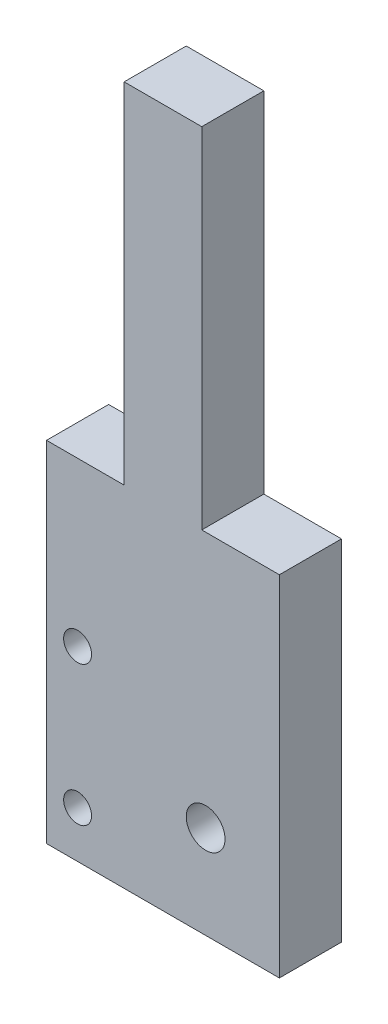
ISO-10303-21;
HEADER;
FILE_DESCRIPTION(('STEP AP214'),'2;1');
FILE_NAME('part.step','',(''),(''),'','','');
FILE_SCHEMA(('AUTOMOTIVE_DESIGN { 1 0 10303 214 1 1 1 1 }'));
ENDSEC;
DATA;
#1=APPLICATION_CONTEXT('core data for automotive mechanical design processes');
#2=APPLICATION_PROTOCOL_DEFINITION('international standard','automotive_design',2000,#1);
#3=PRODUCT_CONTEXT('',#1,'mechanical');
#4=PRODUCT('Part','Part','',(#3));
#5=PRODUCT_RELATED_PRODUCT_CATEGORY('part','',(#4));
#6=PRODUCT_DEFINITION_FORMATION('','',#4);
#7=PRODUCT_DEFINITION_CONTEXT('part definition',#1,'design');
#8=PRODUCT_DEFINITION('design','',#6,#7);
#9=PRODUCT_DEFINITION_SHAPE('','',#8);
#10=(LENGTH_UNIT() NAMED_UNIT(*) SI_UNIT(.MILLI.,.METRE.));
#11=(NAMED_UNIT(*) PLANE_ANGLE_UNIT() SI_UNIT($,.RADIAN.));
#12=(NAMED_UNIT(*) SI_UNIT($,.STERADIAN.) SOLID_ANGLE_UNIT());
#13=UNCERTAINTY_MEASURE_WITH_UNIT(LENGTH_MEASURE(1.E-05),#10,'distance_accuracy_value','');
#14=(GEOMETRIC_REPRESENTATION_CONTEXT(3) GLOBAL_UNCERTAINTY_ASSIGNED_CONTEXT((#13)) GLOBAL_UNIT_ASSIGNED_CONTEXT((#10,
#11,#12)) REPRESENTATION_CONTEXT('',''));
#15=CARTESIAN_POINT('',(0.,0.,0.));
#16=DIRECTION('',(0.,0.,1.));
#17=DIRECTION('',(1.,0.,0.));
#18=AXIS2_PLACEMENT_3D('',#15,#16,#17);
#19=CARTESIAN_POINT('',(0.,0.,10.16));
#20=DIRECTION('',(0.,0.,1.));
#21=DIRECTION('',(1.,0.,0.));
#22=AXIS2_PLACEMENT_3D('',#19,#20,#21);
#23=PLANE('',#22);
#24=CARTESIAN_POINT('',(5.08,30.48,10.16));
#25=DIRECTION('',(0.,0.,1.));
#26=DIRECTION('',(1.,0.,0.));
#27=AXIS2_PLACEMENT_3D('',#24,#25,#26);
#28=CIRCLE('',#27,2.286);
#29=CARTESIAN_POINT('',(7.366,30.48,10.16));
#30=VERTEX_POINT('',#29);
#31=EDGE_CURVE('E181',#30,#30,#28,.T.);
#32=ORIENTED_EDGE('',*,*,#31,.F.);
#33=EDGE_LOOP('',(#32));
#34=FACE_BOUND('',#33,.T.);
#35=DIRECTION('',(0.,-1.,0.));
#36=VECTOR('',#35,1.);
#37=CARTESIAN_POINT('',(0.,57.15,10.16));
#38=LINE('',#37,#36);
#39=CARTESIAN_POINT('',(0.,57.15,10.16));
#40=VERTEX_POINT('',#39);
#41=CARTESIAN_POINT('',(0.,0.,10.16));
#42=VERTEX_POINT('',#41);
#43=EDGE_CURVE('E144',#40,#42,#38,.T.);
#44=ORIENTED_EDGE('',*,*,#43,.T.);
#45=DIRECTION('',(1.,0.,0.));
#46=VECTOR('',#45,1.);
#47=CARTESIAN_POINT('',(0.,0.,10.16));
#48=LINE('',#47,#46);
#49=CARTESIAN_POINT('',(38.1,0.,10.16));
#50=VERTEX_POINT('',#49);
#51=EDGE_CURVE('E92',#42,#50,#48,.T.);
#52=ORIENTED_EDGE('',*,*,#51,.T.);
#53=DIRECTION('',(0.,1.,0.));
#54=VECTOR('',#53,1.);
#55=CARTESIAN_POINT('',(38.1,57.15,10.16));
#56=LINE('',#55,#54);
#57=CARTESIAN_POINT('',(38.1,57.15,10.16));
#58=VERTEX_POINT('',#57);
#59=EDGE_CURVE('E159',#50,#58,#56,.T.);
#60=ORIENTED_EDGE('',*,*,#59,.T.);
#61=DIRECTION('',(-1.,0.,0.));
#62=VECTOR('',#61,1.);
#63=CARTESIAN_POINT('',(25.4,57.15,10.16));
#64=LINE('',#63,#62);
#65=CARTESIAN_POINT('',(25.4,57.15,10.16));
#66=VERTEX_POINT('',#65);
#67=EDGE_CURVE('E172',#58,#66,#64,.T.);
#68=ORIENTED_EDGE('',*,*,#67,.T.);
#69=DIRECTION('',(0.,1.,0.));
#70=VECTOR('',#69,1.);
#71=CARTESIAN_POINT('',(25.4,114.3,10.16));
#72=LINE('',#71,#70);
#73=CARTESIAN_POINT('',(25.4,114.3,10.16));
#74=VERTEX_POINT('',#73);
#75=EDGE_CURVE('E111',#66,#74,#72,.T.);
#76=ORIENTED_EDGE('',*,*,#75,.T.);
#77=DIRECTION('',(-1.,0.,0.));
#78=VECTOR('',#77,1.);
#79=CARTESIAN_POINT('',(12.7,114.3,10.16));
#80=LINE('',#79,#78);
#81=CARTESIAN_POINT('',(12.7,114.3,10.16));
#82=VERTEX_POINT('',#81);
#83=EDGE_CURVE('E105',#74,#82,#80,.T.);
#84=ORIENTED_EDGE('',*,*,#83,.T.);
#85=DIRECTION('',(0.,-1.,0.));
#86=VECTOR('',#85,1.);
#87=CARTESIAN_POINT('',(12.7,57.15,10.16));
#88=LINE('',#87,#86);
#89=CARTESIAN_POINT('',(12.7,57.15,10.16));
#90=VERTEX_POINT('',#89);
#91=EDGE_CURVE('E109',#82,#90,#88,.T.);
#92=ORIENTED_EDGE('',*,*,#91,.T.);
#93=DIRECTION('',(-1.,0.,0.));
#94=VECTOR('',#93,1.);
#95=CARTESIAN_POINT('',(0.,57.15,10.16));
#96=LINE('',#95,#94);
#97=EDGE_CURVE('E49',#90,#40,#96,.T.);
#98=ORIENTED_EDGE('',*,*,#97,.T.);
#99=EDGE_LOOP('',(#44,#52,#60,#68,#76,#84,#92,#98));
#100=FACE_BOUND('',#99,.T.);
#101=CARTESIAN_POINT('',(5.08,7.62,10.16));
#102=DIRECTION('',(0.,0.,1.));
#103=DIRECTION('',(1.,0.,0.));
#104=AXIS2_PLACEMENT_3D('',#101,#102,#103);
#105=CIRCLE('',#104,2.286);
#106=CARTESIAN_POINT('',(7.366,7.62,10.16));
#107=VERTEX_POINT('',#106);
#108=EDGE_CURVE('E133',#107,#107,#105,.T.);
#109=ORIENTED_EDGE('',*,*,#108,.F.);
#110=EDGE_LOOP('',(#109));
#111=FACE_BOUND('',#110,.T.);
#112=CARTESIAN_POINT('',(26.035,15.24,10.16));
#113=DIRECTION('',(0.,0.,1.));
#114=DIRECTION('',(1.,0.,0.));
#115=AXIS2_PLACEMENT_3D('',#112,#113,#114);
#116=CIRCLE('',#115,3.175);
#117=CARTESIAN_POINT('',(29.21,15.24,10.16));
#118=VERTEX_POINT('',#117);
#119=EDGE_CURVE('E187',#118,#118,#116,.T.);
#120=ORIENTED_EDGE('',*,*,#119,.F.);
#121=EDGE_LOOP('',(#120));
#122=FACE_BOUND('',#121,.T.);
#123=ADVANCED_FACE('F32',(#34,#100,#111,#122),#23,.T.);
#124=CARTESIAN_POINT('',(0.,0.,0.));
#125=DIRECTION('',(0.,0.,1.));
#126=DIRECTION('',(1.,0.,0.));
#127=AXIS2_PLACEMENT_3D('',#124,#125,#126);
#128=PLANE('',#127);
#129=DIRECTION('',(0.,-1.,0.));
#130=VECTOR('',#129,1.);
#131=CARTESIAN_POINT('',(0.,57.15,0.));
#132=LINE('',#131,#130);
#133=CARTESIAN_POINT('',(0.,57.15,0.));
#134=VERTEX_POINT('',#133);
#135=CARTESIAN_POINT('',(0.,0.,0.));
#136=VERTEX_POINT('',#135);
#137=EDGE_CURVE('E129',#134,#136,#132,.T.);
#138=ORIENTED_EDGE('',*,*,#137,.F.);
#139=DIRECTION('',(-1.,0.,0.));
#140=VECTOR('',#139,1.);
#141=CARTESIAN_POINT('',(0.,57.15,0.));
#142=LINE('',#141,#140);
#143=CARTESIAN_POINT('',(12.7,57.15,0.));
#144=VERTEX_POINT('',#143);
#145=EDGE_CURVE('E84',#144,#134,#142,.T.);
#146=ORIENTED_EDGE('',*,*,#145,.F.);
#147=DIRECTION('',(0.,-1.,0.));
#148=VECTOR('',#147,1.);
#149=CARTESIAN_POINT('',(12.7,57.15,0.));
#150=LINE('',#149,#148);
#151=CARTESIAN_POINT('',(12.7,114.3,0.));
#152=VERTEX_POINT('',#151);
#153=EDGE_CURVE('E78',#152,#144,#150,.T.);
#154=ORIENTED_EDGE('',*,*,#153,.F.);
#155=DIRECTION('',(-1.,0.,0.));
#156=VECTOR('',#155,1.);
#157=CARTESIAN_POINT('',(12.7,114.3,0.));
#158=LINE('',#157,#156);
#159=CARTESIAN_POINT('',(25.4,114.3,0.));
#160=VERTEX_POINT('',#159);
#161=EDGE_CURVE('E119',#160,#152,#158,.T.);
#162=ORIENTED_EDGE('',*,*,#161,.F.);
#163=DIRECTION('',(0.,1.,0.));
#164=VECTOR('',#163,1.);
#165=CARTESIAN_POINT('',(25.4,114.3,0.));
#166=LINE('',#165,#164);
#167=CARTESIAN_POINT('',(25.4,57.15,0.));
#168=VERTEX_POINT('',#167);
#169=EDGE_CURVE('E139',#168,#160,#166,.T.);
#170=ORIENTED_EDGE('',*,*,#169,.F.);
#171=DIRECTION('',(-1.,0.,0.));
#172=VECTOR('',#171,1.);
#173=CARTESIAN_POINT('',(25.4,57.15,0.));
#174=LINE('',#173,#172);
#175=CARTESIAN_POINT('',(38.1,57.15,0.));
#176=VERTEX_POINT('',#175);
#177=EDGE_CURVE('E137',#176,#168,#174,.T.);
#178=ORIENTED_EDGE('',*,*,#177,.F.);
#179=DIRECTION('',(0.,1.,0.));
#180=VECTOR('',#179,1.);
#181=CARTESIAN_POINT('',(38.1,57.15,0.));
#182=LINE('',#181,#180);
#183=CARTESIAN_POINT('',(38.1,0.,0.));
#184=VERTEX_POINT('',#183);
#185=EDGE_CURVE('E135',#184,#176,#182,.T.);
#186=ORIENTED_EDGE('',*,*,#185,.F.);
#187=DIRECTION('',(1.,0.,0.));
#188=VECTOR('',#187,1.);
#189=CARTESIAN_POINT('',(0.,0.,0.));
#190=LINE('',#189,#188);
#191=EDGE_CURVE('E132',#136,#184,#190,.T.);
#192=ORIENTED_EDGE('',*,*,#191,.F.);
#193=EDGE_LOOP('',(#138,#146,#154,#162,#170,#178,#186,#192));
#194=FACE_BOUND('',#193,.T.);
#195=CARTESIAN_POINT('',(5.08,7.62,0.));
#196=DIRECTION('',(0.,0.,1.));
#197=DIRECTION('',(1.,0.,0.));
#198=AXIS2_PLACEMENT_3D('',#195,#196,#197);
#199=CIRCLE('',#198,2.286);
#200=CARTESIAN_POINT('',(7.366,7.62,0.));
#201=VERTEX_POINT('',#200);
#202=EDGE_CURVE('E178',#201,#201,#199,.T.);
#203=ORIENTED_EDGE('',*,*,#202,.T.);
#204=EDGE_LOOP('',(#203));
#205=FACE_BOUND('',#204,.T.);
#206=CARTESIAN_POINT('',(5.08,30.48,0.));
#207=DIRECTION('',(0.,0.,1.));
#208=DIRECTION('',(1.,0.,0.));
#209=AXIS2_PLACEMENT_3D('',#206,#207,#208);
#210=CIRCLE('',#209,2.286);
#211=CARTESIAN_POINT('',(7.366,30.48,0.));
#212=VERTEX_POINT('',#211);
#213=EDGE_CURVE('E184',#212,#212,#210,.T.);
#214=ORIENTED_EDGE('',*,*,#213,.T.);
#215=EDGE_LOOP('',(#214));
#216=FACE_BOUND('',#215,.T.);
#217=CARTESIAN_POINT('',(26.035,15.24,0.));
#218=DIRECTION('',(0.,0.,1.));
#219=DIRECTION('',(1.,0.,0.));
#220=AXIS2_PLACEMENT_3D('',#217,#218,#219);
#221=CIRCLE('',#220,3.175);
#222=CARTESIAN_POINT('',(29.21,15.24,0.));
#223=VERTEX_POINT('',#222);
#224=EDGE_CURVE('E190',#223,#223,#221,.T.);
#225=ORIENTED_EDGE('',*,*,#224,.T.);
#226=EDGE_LOOP('',(#225));
#227=FACE_BOUND('',#226,.T.);
#228=ADVANCED_FACE('F163',(#194,#205,#216,#227),#128,.F.);
#229=CARTESIAN_POINT('',(0.,57.15,10.16));
#230=DIRECTION('',(1.,0.,0.));
#231=DIRECTION('',(0.,0.,-1.));
#232=AXIS2_PLACEMENT_3D('',#229,#230,#231);
#233=PLANE('',#232);
#234=ORIENTED_EDGE('',*,*,#137,.T.);
#235=DIRECTION('',(0.,0.,-1.));
#236=VECTOR('',#235,1.);
#237=CARTESIAN_POINT('',(0.,0.,10.16));
#238=LINE('',#237,#236);
#239=EDGE_CURVE('E11',#42,#136,#238,.T.);
#240=ORIENTED_EDGE('',*,*,#239,.F.);
#241=ORIENTED_EDGE('',*,*,#43,.F.);
#242=DIRECTION('',(0.,0.,-1.));
#243=VECTOR('',#242,1.);
#244=CARTESIAN_POINT('',(0.,57.15,10.16));
#245=LINE('',#244,#243);
#246=EDGE_CURVE('E125',#40,#134,#245,.T.);
#247=ORIENTED_EDGE('',*,*,#246,.T.);
#248=EDGE_LOOP('',(#234,#240,#241,#247));
#249=FACE_BOUND('',#248,.T.);
#250=ADVANCED_FACE('F34',(#249),#233,.F.);
#251=CARTESIAN_POINT('',(0.,0.,10.16));
#252=DIRECTION('',(0.,1.,0.));
#253=DIRECTION('',(0.,0.,1.));
#254=AXIS2_PLACEMENT_3D('',#251,#252,#253);
#255=PLANE('',#254);
#256=ORIENTED_EDGE('',*,*,#191,.T.);
#257=DIRECTION('',(0.,0.,-1.));
#258=VECTOR('',#257,1.);
#259=CARTESIAN_POINT('',(38.1,0.,10.16));
#260=LINE('',#259,#258);
#261=EDGE_CURVE('E41',#50,#184,#260,.T.);
#262=ORIENTED_EDGE('',*,*,#261,.F.);
#263=ORIENTED_EDGE('',*,*,#51,.F.);
#264=ORIENTED_EDGE('',*,*,#239,.T.);
#265=EDGE_LOOP('',(#256,#262,#263,#264));
#266=FACE_BOUND('',#265,.T.);
#267=ADVANCED_FACE('F223',(#266),#255,.F.);
#268=CARTESIAN_POINT('',(38.1,57.15,10.16));
#269=DIRECTION('',(-1.,0.,0.));
#270=DIRECTION('',(0.,0.,1.));
#271=AXIS2_PLACEMENT_3D('',#268,#269,#270);
#272=PLANE('',#271);
#273=ORIENTED_EDGE('',*,*,#185,.T.);
#274=DIRECTION('',(0.,0.,-1.));
#275=VECTOR('',#274,1.);
#276=CARTESIAN_POINT('',(38.1,57.15,10.16));
#277=LINE('',#276,#275);
#278=EDGE_CURVE('E151',#58,#176,#277,.T.);
#279=ORIENTED_EDGE('',*,*,#278,.F.);
#280=ORIENTED_EDGE('',*,*,#59,.F.);
#281=ORIENTED_EDGE('',*,*,#261,.T.);
#282=EDGE_LOOP('',(#273,#279,#280,#281));
#283=FACE_BOUND('',#282,.T.);
#284=ADVANCED_FACE('F157',(#283),#272,.F.);
#285=CARTESIAN_POINT('',(25.4,57.15,10.16));
#286=DIRECTION('',(0.,-1.,0.));
#287=DIRECTION('',(1.,0.,0.));
#288=AXIS2_PLACEMENT_3D('',#285,#286,#287);
#289=PLANE('',#288);
#290=ORIENTED_EDGE('',*,*,#177,.T.);
#291=DIRECTION('',(0.,0.,-1.));
#292=VECTOR('',#291,1.);
#293=CARTESIAN_POINT('',(25.4,57.15,10.16));
#294=LINE('',#293,#292);
#295=EDGE_CURVE('E148',#66,#168,#294,.T.);
#296=ORIENTED_EDGE('',*,*,#295,.F.);
#297=ORIENTED_EDGE('',*,*,#67,.F.);
#298=ORIENTED_EDGE('',*,*,#278,.T.);
#299=EDGE_LOOP('',(#290,#296,#297,#298));
#300=FACE_BOUND('',#299,.T.);
#301=ADVANCED_FACE('F168',(#300),#289,.F.);
#302=CARTESIAN_POINT('',(25.4,114.3,10.16));
#303=DIRECTION('',(-1.,0.,0.));
#304=DIRECTION('',(0.,-1.,0.));
#305=AXIS2_PLACEMENT_3D('',#302,#303,#304);
#306=PLANE('',#305);
#307=ORIENTED_EDGE('',*,*,#169,.T.);
#308=DIRECTION('',(0.,0.,-1.));
#309=VECTOR('',#308,1.);
#310=CARTESIAN_POINT('',(25.4,114.3,10.16));
#311=LINE('',#310,#309);
#312=EDGE_CURVE('E120',#74,#160,#311,.T.);
#313=ORIENTED_EDGE('',*,*,#312,.F.);
#314=ORIENTED_EDGE('',*,*,#75,.F.);
#315=ORIENTED_EDGE('',*,*,#295,.T.);
#316=EDGE_LOOP('',(#307,#313,#314,#315));
#317=FACE_BOUND('',#316,.T.);
#318=ADVANCED_FACE('F171',(#317),#306,.F.);
#319=CARTESIAN_POINT('',(12.7,114.3,10.16));
#320=DIRECTION('',(0.,-1.,0.));
#321=DIRECTION('',(0.,0.,-1.));
#322=AXIS2_PLACEMENT_3D('',#319,#320,#321);
#323=PLANE('',#322);
#324=ORIENTED_EDGE('',*,*,#161,.T.);
#325=DIRECTION('',(0.,0.,-1.));
#326=VECTOR('',#325,1.);
#327=CARTESIAN_POINT('',(12.7,114.3,10.16));
#328=LINE('',#327,#326);
#329=EDGE_CURVE('E116',#82,#152,#328,.T.);
#330=ORIENTED_EDGE('',*,*,#329,.F.);
#331=ORIENTED_EDGE('',*,*,#83,.F.);
#332=ORIENTED_EDGE('',*,*,#312,.T.);
#333=EDGE_LOOP('',(#324,#330,#331,#332));
#334=FACE_BOUND('',#333,.T.);
#335=ADVANCED_FACE('F117',(#334),#323,.F.);
#336=CARTESIAN_POINT('',(12.7,57.15,10.16));
#337=DIRECTION('',(1.,0.,0.));
#338=DIRECTION('',(0.,0.,-1.));
#339=AXIS2_PLACEMENT_3D('',#336,#337,#338);
#340=PLANE('',#339);
#341=ORIENTED_EDGE('',*,*,#153,.T.);
#342=DIRECTION('',(0.,0.,-1.));
#343=VECTOR('',#342,1.);
#344=CARTESIAN_POINT('',(12.7,57.15,10.16));
#345=LINE('',#344,#343);
#346=EDGE_CURVE('E121',#90,#144,#345,.T.);
#347=ORIENTED_EDGE('',*,*,#346,.F.);
#348=ORIENTED_EDGE('',*,*,#91,.F.);
#349=ORIENTED_EDGE('',*,*,#329,.T.);
#350=EDGE_LOOP('',(#341,#347,#348,#349));
#351=FACE_BOUND('',#350,.T.);
#352=ADVANCED_FACE('F123',(#351),#340,.F.);
#353=CARTESIAN_POINT('',(0.,57.15,10.16));
#354=DIRECTION('',(0.,-1.,0.));
#355=DIRECTION('',(0.,0.,-1.));
#356=AXIS2_PLACEMENT_3D('',#353,#354,#355);
#357=PLANE('',#356);
#358=ORIENTED_EDGE('',*,*,#145,.T.);
#359=ORIENTED_EDGE('',*,*,#246,.F.);
#360=ORIENTED_EDGE('',*,*,#97,.F.);
#361=ORIENTED_EDGE('',*,*,#346,.T.);
#362=EDGE_LOOP('',(#358,#359,#360,#361));
#363=FACE_BOUND('',#362,.T.);
#364=ADVANCED_FACE('F211',(#363),#357,.F.);
#365=CARTESIAN_POINT('',(5.08,7.62,10.16));
#366=DIRECTION('',(0.,0.,-1.));
#367=DIRECTION('',(-1.,0.,0.));
#368=AXIS2_PLACEMENT_3D('',#365,#366,#367);
#369=CYLINDRICAL_SURFACE('',#368,2.286);
#370=ORIENTED_EDGE('',*,*,#108,.T.);
#371=EDGE_LOOP('',(#370));
#372=FACE_BOUND('',#371,.T.);
#373=ORIENTED_EDGE('',*,*,#202,.F.);
#374=EDGE_LOOP('',(#373));
#375=FACE_BOUND('',#374,.T.);
#376=ADVANCED_FACE('F208',(#372,#375),#369,.F.);
#377=CARTESIAN_POINT('',(5.08,30.48,10.16));
#378=DIRECTION('',(0.,0.,-1.));
#379=DIRECTION('',(-1.,0.,0.));
#380=AXIS2_PLACEMENT_3D('',#377,#378,#379);
#381=CYLINDRICAL_SURFACE('',#380,2.286);
#382=ORIENTED_EDGE('',*,*,#31,.T.);
#383=EDGE_LOOP('',(#382));
#384=FACE_BOUND('',#383,.T.);
#385=ORIENTED_EDGE('',*,*,#213,.F.);
#386=EDGE_LOOP('',(#385));
#387=FACE_BOUND('',#386,.T.);
#388=ADVANCED_FACE('F287',(#384,#387),#381,.F.);
#389=CARTESIAN_POINT('',(26.035,15.24,10.16));
#390=DIRECTION('',(0.,0.,-1.));
#391=DIRECTION('',(-1.,0.,0.));
#392=AXIS2_PLACEMENT_3D('',#389,#390,#391);
#393=CYLINDRICAL_SURFACE('',#392,3.175);
#394=ORIENTED_EDGE('',*,*,#119,.T.);
#395=EDGE_LOOP('',(#394));
#396=FACE_BOUND('',#395,.T.);
#397=ORIENTED_EDGE('',*,*,#224,.F.);
#398=EDGE_LOOP('',(#397));
#399=FACE_BOUND('',#398,.T.);
#400=ADVANCED_FACE('F196',(#396,#399),#393,.F.);
#401=CLOSED_SHELL('',(#123,#228,#250,#267,#284,#301,#318,#335,#352,#364,#376,#388,#400));
#402=MANIFOLD_SOLID_BREP('B2',#401);
#403=ADVANCED_BREP_SHAPE_REPRESENTATION('',(#18,#402),#14);
#404=SHAPE_DEFINITION_REPRESENTATION(#9,#403);
ENDSEC;
END-ISO-10303-21;
